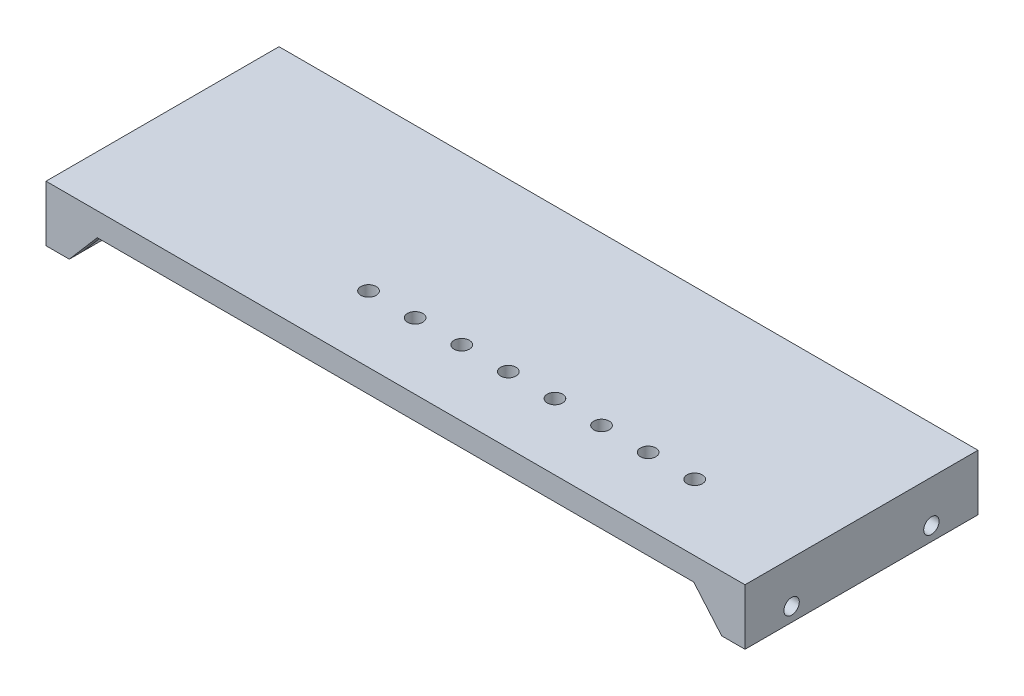
ISO-10303-21;
HEADER;
FILE_DESCRIPTION(('STEP AP214'),'2;1');
FILE_NAME('part.step','',(''),(''),'','','');
FILE_SCHEMA(('AUTOMOTIVE_DESIGN { 1 0 10303 214 1 1 1 1 }'));
ENDSEC;
DATA;
#1=APPLICATION_CONTEXT('core data for automotive mechanical design processes');
#2=APPLICATION_PROTOCOL_DEFINITION('international standard','automotive_design',2000,#1);
#3=PRODUCT_CONTEXT('',#1,'mechanical');
#4=PRODUCT('Part','Part','',(#3));
#5=PRODUCT_RELATED_PRODUCT_CATEGORY('part','',(#4));
#6=PRODUCT_DEFINITION_FORMATION('','',#4);
#7=PRODUCT_DEFINITION_CONTEXT('part definition',#1,'design');
#8=PRODUCT_DEFINITION('design','',#6,#7);
#9=PRODUCT_DEFINITION_SHAPE('','',#8);
#10=(LENGTH_UNIT() NAMED_UNIT(*) SI_UNIT(.MILLI.,.METRE.));
#11=(NAMED_UNIT(*) PLANE_ANGLE_UNIT() SI_UNIT($,.RADIAN.));
#12=(NAMED_UNIT(*) SI_UNIT($,.STERADIAN.) SOLID_ANGLE_UNIT());
#13=UNCERTAINTY_MEASURE_WITH_UNIT(LENGTH_MEASURE(1.E-05),#10,'distance_accuracy_value','');
#14=(GEOMETRIC_REPRESENTATION_CONTEXT(3) GLOBAL_UNCERTAINTY_ASSIGNED_CONTEXT((#13)) GLOBAL_UNIT_ASSIGNED_CONTEXT((#10,
#11,#12)) REPRESENTATION_CONTEXT('',''));
#15=CARTESIAN_POINT('',(0.,0.,0.));
#16=DIRECTION('',(0.,0.,1.));
#17=DIRECTION('',(1.,0.,0.));
#18=AXIS2_PLACEMENT_3D('',#15,#16,#17);
#19=CARTESIAN_POINT('',(70.,-5.00000000000002,50.));
#20=DIRECTION('',(0.,1.,0.));
#21=DIRECTION('',(0.,0.,1.));
#22=AXIS2_PLACEMENT_3D('',#19,#20,#21);
#23=PLANE('',#22);
#24=CARTESIAN_POINT('',(50.,-5.00000000000002,35.79));
#25=DIRECTION('',(0.,1.,0.));
#26=DIRECTION('',(0.,0.,1.));
#27=AXIS2_PLACEMENT_3D('',#24,#25,#26);
#28=CIRCLE('',#27,1.65);
#29=CARTESIAN_POINT('',(50.,-5.00000000000002,37.44));
#30=VERTEX_POINT('',#29);
#31=EDGE_CURVE('E160',#30,#30,#28,.T.);
#32=ORIENTED_EDGE('',*,*,#31,.T.);
#33=EDGE_LOOP('',(#32));
#34=FACE_BOUND('',#33,.T.);
#35=CARTESIAN_POINT('',(40.,-5.00000000000002,35.7900000000001));
#36=DIRECTION('',(0.,1.,0.));
#37=DIRECTION('',(0.,0.,1.));
#38=AXIS2_PLACEMENT_3D('',#35,#36,#37);
#39=CIRCLE('',#38,1.65);
#40=CARTESIAN_POINT('',(40.,-5.00000000000002,37.4400000000001));
#41=VERTEX_POINT('',#40);
#42=EDGE_CURVE('E607',#41,#41,#39,.T.);
#43=ORIENTED_EDGE('',*,*,#42,.T.);
#44=EDGE_LOOP('',(#43));
#45=FACE_BOUND('',#44,.T.);
#46=CARTESIAN_POINT('',(30.,-5.00000000000002,35.7900000000001));
#47=DIRECTION('',(0.,1.,0.));
#48=DIRECTION('',(0.,0.,1.));
#49=AXIS2_PLACEMENT_3D('',#46,#47,#48);
#50=CIRCLE('',#49,1.65);
#51=CARTESIAN_POINT('',(30.,-5.00000000000002,37.4400000000001));
#52=VERTEX_POINT('',#51);
#53=EDGE_CURVE('E609',#52,#52,#50,.T.);
#54=ORIENTED_EDGE('',*,*,#53,.T.);
#55=EDGE_LOOP('',(#54));
#56=FACE_BOUND('',#55,.T.);
#57=CARTESIAN_POINT('',(20.,-5.00000000000002,35.7900000000002));
#58=DIRECTION('',(0.,1.,0.));
#59=DIRECTION('',(0.,0.,1.));
#60=AXIS2_PLACEMENT_3D('',#57,#58,#59);
#61=CIRCLE('',#60,1.65);
#62=CARTESIAN_POINT('',(20.,-5.00000000000002,37.4400000000002));
#63=VERTEX_POINT('',#62);
#64=EDGE_CURVE('E612',#63,#63,#61,.T.);
#65=ORIENTED_EDGE('',*,*,#64,.T.);
#66=EDGE_LOOP('',(#65));
#67=FACE_BOUND('',#66,.T.);
#68=CARTESIAN_POINT('',(9.99999999999999,-5.00000000000002,35.7900000000003));
#69=DIRECTION('',(0.,1.,0.));
#70=DIRECTION('',(0.,0.,1.));
#71=AXIS2_PLACEMENT_3D('',#68,#69,#70);
#72=CIRCLE('',#71,1.65);
#73=CARTESIAN_POINT('',(9.99999999999999,-5.00000000000002,37.4400000000003));
#74=VERTEX_POINT('',#73);
#75=EDGE_CURVE('E617',#74,#74,#72,.T.);
#76=ORIENTED_EDGE('',*,*,#75,.T.);
#77=EDGE_LOOP('',(#76));
#78=FACE_BOUND('',#77,.T.);
#79=CARTESIAN_POINT('',(0.,-5.00000000000002,35.7900000000003));
#80=DIRECTION('',(0.,1.,0.));
#81=DIRECTION('',(0.,0.,1.));
#82=AXIS2_PLACEMENT_3D('',#79,#80,#81);
#83=CIRCLE('',#82,1.65);
#84=CARTESIAN_POINT('',(0.,-5.00000000000002,37.4400000000003));
#85=VERTEX_POINT('',#84);
#86=EDGE_CURVE('E620',#85,#85,#83,.T.);
#87=ORIENTED_EDGE('',*,*,#86,.T.);
#88=EDGE_LOOP('',(#87));
#89=FACE_BOUND('',#88,.T.);
#90=CARTESIAN_POINT('',(-10.,-5.00000000000002,35.7900000000004));
#91=DIRECTION('',(0.,1.,0.));
#92=DIRECTION('',(0.,0.,1.));
#93=AXIS2_PLACEMENT_3D('',#90,#91,#92);
#94=CIRCLE('',#93,1.65);
#95=CARTESIAN_POINT('',(-10.,-5.00000000000002,37.4400000000004));
#96=VERTEX_POINT('',#95);
#97=EDGE_CURVE('E623',#96,#96,#94,.T.);
#98=ORIENTED_EDGE('',*,*,#97,.T.);
#99=EDGE_LOOP('',(#98));
#100=FACE_BOUND('',#99,.T.);
#101=CARTESIAN_POINT('',(-20.,-5.00000000000002,35.7900000000005));
#102=DIRECTION('',(0.,1.,0.));
#103=DIRECTION('',(0.,0.,1.));
#104=AXIS2_PLACEMENT_3D('',#101,#102,#103);
#105=CIRCLE('',#104,1.65);
#106=CARTESIAN_POINT('',(-20.,-5.00000000000002,37.4400000000005));
#107=VERTEX_POINT('',#106);
#108=EDGE_CURVE('E626',#107,#107,#105,.T.);
#109=ORIENTED_EDGE('',*,*,#108,.T.);
#110=EDGE_LOOP('',(#109));
#111=FACE_BOUND('',#110,.T.);
#112=DIRECTION('',(-1.,0.,0.));
#113=VECTOR('',#112,1.);
#114=CARTESIAN_POINT('',(64.,-5.00000000000002,47.));
#115=LINE('',#114,#113);
#116=CARTESIAN_POINT('',(70.,-5.00000000000002,47.));
#117=VERTEX_POINT('',#116);
#118=CARTESIAN_POINT('',(64.,-5.00000000000002,47.));
#119=VERTEX_POINT('',#118);
#120=EDGE_CURVE('E156',#117,#119,#115,.T.);
#121=ORIENTED_EDGE('',*,*,#120,.T.);
#122=DIRECTION('',(0.,0.,1.));
#123=VECTOR('',#122,1.);
#124=CARTESIAN_POINT('',(64.,-5.00000000000002,47.));
#125=LINE('',#124,#123);
#126=CARTESIAN_POINT('',(64.,-5.00000000000002,50.));
#127=VERTEX_POINT('',#126);
#128=EDGE_CURVE('E141',#119,#127,#125,.T.);
#129=ORIENTED_EDGE('',*,*,#128,.T.);
#130=DIRECTION('',(1.,0.,0.));
#131=VECTOR('',#130,1.);
#132=CARTESIAN_POINT('',(70.,-5.00000000000002,50.));
#133=LINE('',#132,#131);
#134=CARTESIAN_POINT('',(-64.,-5.00000000000002,50.));
#135=VERTEX_POINT('',#134);
#136=EDGE_CURVE('E241',#135,#127,#133,.T.);
#137=ORIENTED_EDGE('',*,*,#136,.F.);
#138=DIRECTION('',(0.,0.,1.));
#139=VECTOR('',#138,1.);
#140=CARTESIAN_POINT('',(-64.,-5.00000000000002,47.));
#141=LINE('',#140,#139);
#142=CARTESIAN_POINT('',(-64.,-5.00000000000002,47.));
#143=VERTEX_POINT('',#142);
#144=EDGE_CURVE('E189',#143,#135,#141,.T.);
#145=ORIENTED_EDGE('',*,*,#144,.F.);
#146=DIRECTION('',(1.,0.,0.));
#147=VECTOR('',#146,1.);
#148=CARTESIAN_POINT('',(-64.,-5.00000000000002,47.));
#149=LINE('',#148,#147);
#150=CARTESIAN_POINT('',(-70.,-5.00000000000002,47.));
#151=VERTEX_POINT('',#150);
#152=EDGE_CURVE('E182',#151,#143,#149,.T.);
#153=ORIENTED_EDGE('',*,*,#152,.F.);
#154=DIRECTION('',(0.,0.,-1.));
#155=VECTOR('',#154,1.);
#156=CARTESIAN_POINT('',(-70.,-5.00000000000002,50.));
#157=LINE('',#156,#155);
#158=CARTESIAN_POINT('',(-70.,-5.00000000000002,3.));
#159=VERTEX_POINT('',#158);
#160=EDGE_CURVE('E274',#151,#159,#157,.T.);
#161=ORIENTED_EDGE('',*,*,#160,.T.);
#162=DIRECTION('',(1.,0.,0.));
#163=VECTOR('',#162,1.);
#164=CARTESIAN_POINT('',(-64.,-5.00000000000002,3.));
#165=LINE('',#164,#163);
#166=CARTESIAN_POINT('',(-64.,-5.00000000000002,3.));
#167=VERTEX_POINT('',#166);
#168=EDGE_CURVE('E194',#159,#167,#165,.T.);
#169=ORIENTED_EDGE('',*,*,#168,.T.);
#170=DIRECTION('',(0.,0.,-1.));
#171=VECTOR('',#170,1.);
#172=CARTESIAN_POINT('',(-64.,-5.00000000000002,3.));
#173=LINE('',#172,#171);
#174=CARTESIAN_POINT('',(-64.,-5.00000000000001,0.));
#175=VERTEX_POINT('',#174);
#176=EDGE_CURVE('E202',#167,#175,#173,.T.);
#177=ORIENTED_EDGE('',*,*,#176,.T.);
#178=DIRECTION('',(1.,0.,0.));
#179=VECTOR('',#178,1.);
#180=CARTESIAN_POINT('',(70.,-5.00000000000002,0.));
#181=LINE('',#180,#179);
#182=CARTESIAN_POINT('',(64.,-5.00000000000002,0.));
#183=VERTEX_POINT('',#182);
#184=EDGE_CURVE('E254',#175,#183,#181,.T.);
#185=ORIENTED_EDGE('',*,*,#184,.T.);
#186=DIRECTION('',(0.,0.,-1.));
#187=VECTOR('',#186,1.);
#188=CARTESIAN_POINT('',(64.,-5.00000000000002,3.));
#189=LINE('',#188,#187);
#190=CARTESIAN_POINT('',(64.,-5.00000000000002,3.));
#191=VERTEX_POINT('',#190);
#192=EDGE_CURVE('E54',#191,#183,#189,.T.);
#193=ORIENTED_EDGE('',*,*,#192,.F.);
#194=DIRECTION('',(-1.,0.,0.));
#195=VECTOR('',#194,1.);
#196=CARTESIAN_POINT('',(64.,-5.00000000000002,3.));
#197=LINE('',#196,#195);
#198=CARTESIAN_POINT('',(70.,-5.00000000000002,3.));
#199=VERTEX_POINT('',#198);
#200=EDGE_CURVE('E166',#199,#191,#197,.T.);
#201=ORIENTED_EDGE('',*,*,#200,.F.);
#202=DIRECTION('',(0.,0.,-1.));
#203=VECTOR('',#202,1.);
#204=CARTESIAN_POINT('',(70.,-5.00000000000002,50.));
#205=LINE('',#204,#203);
#206=EDGE_CURVE('E62',#117,#199,#205,.T.);
#207=ORIENTED_EDGE('',*,*,#206,.F.);
#208=EDGE_LOOP('',(#121,#129,#137,#145,#153,#161,#169,#177,#185,#193,#201,#207));
#209=FACE_BOUND('',#208,.T.);
#210=ADVANCED_FACE('F39',(#34,#45,#56,#67,#78,#89,#100,#111,#209),#23,.F.);
#211=CARTESIAN_POINT('',(-75.,-12.,50.));
#212=DIRECTION('',(1.,0.,0.));
#213=DIRECTION('',(0.,0.,-1.));
#214=AXIS2_PLACEMENT_3D('',#211,#212,#213);
#215=PLANE('',#214);
#216=CARTESIAN_POINT('',(-75.,-8.99999999999999,10.));
#217=DIRECTION('',(1.,0.,0.));
#218=DIRECTION('',(0.,1.,0.));
#219=AXIS2_PLACEMENT_3D('',#216,#217,#218);
#220=CIRCLE('',#219,1.65);
#221=CARTESIAN_POINT('',(-75.,-7.34999999999999,10.));
#222=VERTEX_POINT('',#221);
#223=EDGE_CURVE('E213',#222,#222,#220,.T.);
#224=ORIENTED_EDGE('',*,*,#223,.T.);
#225=EDGE_LOOP('',(#224));
#226=FACE_BOUND('',#225,.T.);
#227=CARTESIAN_POINT('',(-75.,-8.99999999999999,40.));
#228=DIRECTION('',(1.,0.,0.));
#229=DIRECTION('',(0.,-1.,0.));
#230=AXIS2_PLACEMENT_3D('',#227,#228,#229);
#231=CIRCLE('',#230,1.65);
#232=CARTESIAN_POINT('',(-75.,-10.65,40.));
#233=VERTEX_POINT('',#232);
#234=EDGE_CURVE('E214',#233,#233,#231,.T.);
#235=ORIENTED_EDGE('',*,*,#234,.T.);
#236=EDGE_LOOP('',(#235));
#237=FACE_BOUND('',#236,.T.);
#238=DIRECTION('',(0.,-1.,0.));
#239=VECTOR('',#238,1.);
#240=CARTESIAN_POINT('',(-75.,-12.,0.));
#241=LINE('',#240,#239);
#242=CARTESIAN_POINT('',(-75.,0.,0.));
#243=VERTEX_POINT('',#242);
#244=CARTESIAN_POINT('',(-75.,-12.,0.));
#245=VERTEX_POINT('',#244);
#246=EDGE_CURVE('E233',#243,#245,#241,.T.);
#247=ORIENTED_EDGE('',*,*,#246,.T.);
#248=DIRECTION('',(0.,0.,-1.));
#249=VECTOR('',#248,1.);
#250=CARTESIAN_POINT('',(-75.,-12.,50.));
#251=LINE('',#250,#249);
#252=CARTESIAN_POINT('',(-75.,-12.,50.));
#253=VERTEX_POINT('',#252);
#254=EDGE_CURVE('E11',#253,#245,#251,.T.);
#255=ORIENTED_EDGE('',*,*,#254,.F.);
#256=DIRECTION('',(0.,-1.,0.));
#257=VECTOR('',#256,1.);
#258=CARTESIAN_POINT('',(-75.,-12.,50.));
#259=LINE('',#258,#257);
#260=CARTESIAN_POINT('',(-75.,0.,50.));
#261=VERTEX_POINT('',#260);
#262=EDGE_CURVE('E234',#261,#253,#259,.T.);
#263=ORIENTED_EDGE('',*,*,#262,.F.);
#264=DIRECTION('',(0.,0.,-1.));
#265=VECTOR('',#264,1.);
#266=CARTESIAN_POINT('',(-75.,0.,50.));
#267=LINE('',#266,#265);
#268=EDGE_CURVE('E249',#261,#243,#267,.T.);
#269=ORIENTED_EDGE('',*,*,#268,.T.);
#270=EDGE_LOOP('',(#247,#255,#263,#269));
#271=FACE_BOUND('',#270,.T.);
#272=ADVANCED_FACE('F41',(#226,#237,#271),#215,.F.);
#273=CARTESIAN_POINT('',(-70.,-12.,50.));
#274=DIRECTION('',(0.,1.,0.));
#275=DIRECTION('',(-1.,0.,0.));
#276=AXIS2_PLACEMENT_3D('',#273,#274,#275);
#277=PLANE('',#276);
#278=DIRECTION('',(1.,0.,0.));
#279=VECTOR('',#278,1.);
#280=CARTESIAN_POINT('',(-70.,-12.,0.));
#281=LINE('',#280,#279);
#282=CARTESIAN_POINT('',(-70.,-12.,0.));
#283=VERTEX_POINT('',#282);
#284=EDGE_CURVE('E252',#245,#283,#281,.T.);
#285=ORIENTED_EDGE('',*,*,#284,.T.);
#286=DIRECTION('',(0.,0.,-1.));
#287=VECTOR('',#286,1.);
#288=CARTESIAN_POINT('',(-70.,-12.,3.));
#289=LINE('',#288,#287);
#290=CARTESIAN_POINT('',(-70.,-12.,3.));
#291=VERTEX_POINT('',#290);
#292=EDGE_CURVE('E205',#291,#283,#289,.T.);
#293=ORIENTED_EDGE('',*,*,#292,.F.);
#294=DIRECTION('',(0.,0.,-1.));
#295=VECTOR('',#294,1.);
#296=CARTESIAN_POINT('',(-70.,-12.,50.));
#297=LINE('',#296,#295);
#298=CARTESIAN_POINT('',(-70.,-12.,47.));
#299=VERTEX_POINT('',#298);
#300=EDGE_CURVE('E275',#299,#291,#297,.T.);
#301=ORIENTED_EDGE('',*,*,#300,.F.);
#302=CARTESIAN_POINT('',(-70.,-12.,50.));
#303=VERTEX_POINT('',#302);
#304=EDGE_CURVE('E47',#303,#299,#297,.T.);
#305=ORIENTED_EDGE('',*,*,#304,.F.);
#306=DIRECTION('',(1.,0.,0.));
#307=VECTOR('',#306,1.);
#308=CARTESIAN_POINT('',(-70.,-12.,50.));
#309=LINE('',#308,#307);
#310=EDGE_CURVE('E237',#253,#303,#309,.T.);
#311=ORIENTED_EDGE('',*,*,#310,.F.);
#312=ORIENTED_EDGE('',*,*,#254,.T.);
#313=EDGE_LOOP('',(#285,#293,#301,#305,#311,#312));
#314=FACE_BOUND('',#313,.T.);
#315=ADVANCED_FACE('F288',(#314),#277,.F.);
#316=CARTESIAN_POINT('',(-70.,-5.00000000000002,50.));
#317=DIRECTION('',(-1.,0.,0.));
#318=DIRECTION('',(0.,-1.,0.));
#319=AXIS2_PLACEMENT_3D('',#316,#317,#318);
#320=PLANE('',#319);
#321=CARTESIAN_POINT('',(-70.,-9.,10.));
#322=DIRECTION('',(-1.,0.,0.));
#323=DIRECTION('',(0.,-1.,0.));
#324=AXIS2_PLACEMENT_3D('',#321,#322,#323);
#325=CIRCLE('',#324,1.65);
#326=CARTESIAN_POINT('',(-70.,-10.65,10.));
#327=VERTEX_POINT('',#326);
#328=EDGE_CURVE('E230',#327,#327,#325,.T.);
#329=ORIENTED_EDGE('',*,*,#328,.T.);
#330=EDGE_LOOP('',(#329));
#331=FACE_BOUND('',#330,.T.);
#332=CARTESIAN_POINT('',(-70.,-9.,40.));
#333=DIRECTION('',(-1.,0.,0.));
#334=DIRECTION('',(0.,-1.,0.));
#335=AXIS2_PLACEMENT_3D('',#332,#333,#334);
#336=CIRCLE('',#335,1.65);
#337=CARTESIAN_POINT('',(-70.,-10.65,40.));
#338=VERTEX_POINT('',#337);
#339=EDGE_CURVE('E224',#338,#338,#336,.T.);
#340=ORIENTED_EDGE('',*,*,#339,.T.);
#341=EDGE_LOOP('',(#340));
#342=FACE_BOUND('',#341,.T.);
#343=ORIENTED_EDGE('',*,*,#160,.F.);
#344=DIRECTION('',(0.,1.,0.));
#345=VECTOR('',#344,1.);
#346=CARTESIAN_POINT('',(-70.,-5.00000000000002,47.));
#347=LINE('',#346,#345);
#348=EDGE_CURVE('E185',#299,#151,#347,.T.);
#349=ORIENTED_EDGE('',*,*,#348,.F.);
#350=ORIENTED_EDGE('',*,*,#300,.T.);
#351=DIRECTION('',(0.,1.,0.));
#352=VECTOR('',#351,1.);
#353=CARTESIAN_POINT('',(-70.,-5.00000000000002,3.));
#354=LINE('',#353,#352);
#355=EDGE_CURVE('E199',#291,#159,#354,.T.);
#356=ORIENTED_EDGE('',*,*,#355,.T.);
#357=EDGE_LOOP('',(#343,#349,#350,#356));
#358=FACE_BOUND('',#357,.T.);
#359=ADVANCED_FACE('F284',(#331,#342,#358),#320,.F.);
#360=CARTESIAN_POINT('',(70.,-12.,50.));
#361=DIRECTION('',(1.,0.,0.));
#362=DIRECTION('',(0.,1.,0.));
#363=AXIS2_PLACEMENT_3D('',#360,#361,#362);
#364=PLANE('',#363);
#365=CARTESIAN_POINT('',(70.,-9.00000000000008,10.));
#366=DIRECTION('',(1.,0.,0.));
#367=DIRECTION('',(0.,1.,0.));
#368=AXIS2_PLACEMENT_3D('',#365,#366,#367);
#369=CIRCLE('',#368,1.65);
#370=CARTESIAN_POINT('',(70.,-7.35000000000008,10.));
#371=VERTEX_POINT('',#370);
#372=EDGE_CURVE('E227',#371,#371,#369,.T.);
#373=ORIENTED_EDGE('',*,*,#372,.T.);
#374=EDGE_LOOP('',(#373));
#375=FACE_BOUND('',#374,.T.);
#376=CARTESIAN_POINT('',(70.,-9.00000000000008,40.));
#377=DIRECTION('',(1.,0.,0.));
#378=DIRECTION('',(0.,1.,0.));
#379=AXIS2_PLACEMENT_3D('',#376,#377,#378);
#380=CIRCLE('',#379,1.65);
#381=CARTESIAN_POINT('',(70.,-7.35000000000007,40.));
#382=VERTEX_POINT('',#381);
#383=EDGE_CURVE('E217',#382,#382,#380,.T.);
#384=ORIENTED_EDGE('',*,*,#383,.T.);
#385=EDGE_LOOP('',(#384));
#386=FACE_BOUND('',#385,.T.);
#387=DIRECTION('',(0.,0.,-1.));
#388=VECTOR('',#387,1.);
#389=CARTESIAN_POINT('',(70.,-12.,50.));
#390=LINE('',#389,#388);
#391=CARTESIAN_POINT('',(70.,-12.,47.));
#392=VERTEX_POINT('',#391);
#393=CARTESIAN_POINT('',(70.,-12.,3.));
#394=VERTEX_POINT('',#393);
#395=EDGE_CURVE('E269',#392,#394,#390,.T.);
#396=ORIENTED_EDGE('',*,*,#395,.F.);
#397=DIRECTION('',(0.,1.,0.));
#398=VECTOR('',#397,1.);
#399=CARTESIAN_POINT('',(70.,-5.00000000000002,47.));
#400=LINE('',#399,#398);
#401=EDGE_CURVE('E152',#392,#117,#400,.T.);
#402=ORIENTED_EDGE('',*,*,#401,.T.);
#403=ORIENTED_EDGE('',*,*,#206,.T.);
#404=DIRECTION('',(0.,1.,0.));
#405=VECTOR('',#404,1.);
#406=CARTESIAN_POINT('',(70.,-5.00000000000002,3.));
#407=LINE('',#406,#405);
#408=EDGE_CURVE('E169',#394,#199,#407,.T.);
#409=ORIENTED_EDGE('',*,*,#408,.F.);
#410=EDGE_LOOP('',(#396,#402,#403,#409));
#411=FACE_BOUND('',#410,.T.);
#412=ADVANCED_FACE('F319',(#375,#386,#411),#364,.F.);
#413=CARTESIAN_POINT('',(75.,-12.,50.));
#414=DIRECTION('',(0.,1.,0.));
#415=DIRECTION('',(0.,0.,1.));
#416=AXIS2_PLACEMENT_3D('',#413,#414,#415);
#417=PLANE('',#416);
#418=DIRECTION('',(1.,0.,0.));
#419=VECTOR('',#418,1.);
#420=CARTESIAN_POINT('',(75.,-12.,0.));
#421=LINE('',#420,#419);
#422=CARTESIAN_POINT('',(70.,-12.,0.));
#423=VERTEX_POINT('',#422);
#424=CARTESIAN_POINT('',(75.,-12.,0.));
#425=VERTEX_POINT('',#424);
#426=EDGE_CURVE('E256',#423,#425,#421,.T.);
#427=ORIENTED_EDGE('',*,*,#426,.T.);
#428=DIRECTION('',(0.,0.,-1.));
#429=VECTOR('',#428,1.);
#430=CARTESIAN_POINT('',(75.,-12.,50.));
#431=LINE('',#430,#429);
#432=CARTESIAN_POINT('',(75.,-12.,50.));
#433=VERTEX_POINT('',#432);
#434=EDGE_CURVE('E266',#433,#425,#431,.T.);
#435=ORIENTED_EDGE('',*,*,#434,.F.);
#436=DIRECTION('',(1.,0.,0.));
#437=VECTOR('',#436,1.);
#438=CARTESIAN_POINT('',(75.,-12.,50.));
#439=LINE('',#438,#437);
#440=CARTESIAN_POINT('',(70.,-12.,50.));
#441=VERTEX_POINT('',#440);
#442=EDGE_CURVE('E243',#441,#433,#439,.T.);
#443=ORIENTED_EDGE('',*,*,#442,.F.);
#444=EDGE_CURVE('E270',#441,#392,#390,.T.);
#445=ORIENTED_EDGE('',*,*,#444,.T.);
#446=ORIENTED_EDGE('',*,*,#395,.T.);
#447=DIRECTION('',(0.,0.,-1.));
#448=VECTOR('',#447,1.);
#449=CARTESIAN_POINT('',(70.,-12.,3.));
#450=LINE('',#449,#448);
#451=EDGE_CURVE('E175',#394,#423,#450,.T.);
#452=ORIENTED_EDGE('',*,*,#451,.T.);
#453=EDGE_LOOP('',(#427,#435,#443,#445,#446,#452));
#454=FACE_BOUND('',#453,.T.);
#455=ADVANCED_FACE('F322',(#454),#417,.F.);
#456=CARTESIAN_POINT('',(75.,0.,50.));
#457=DIRECTION('',(-1.,0.,0.));
#458=DIRECTION('',(0.,0.,1.));
#459=AXIS2_PLACEMENT_3D('',#456,#457,#458);
#460=PLANE('',#459);
#461=CARTESIAN_POINT('',(75.,-9.00000000000008,10.));
#462=DIRECTION('',(1.,0.,0.));
#463=DIRECTION('',(0.,1.,0.));
#464=AXIS2_PLACEMENT_3D('',#461,#462,#463);
#465=CIRCLE('',#464,1.65);
#466=CARTESIAN_POINT('',(75.,-7.35000000000008,10.));
#467=VERTEX_POINT('',#466);
#468=EDGE_CURVE('E210',#467,#467,#465,.T.);
#469=ORIENTED_EDGE('',*,*,#468,.F.);
#470=EDGE_LOOP('',(#469));
#471=FACE_BOUND('',#470,.T.);
#472=CARTESIAN_POINT('',(75.,-9.00000000000008,40.));
#473=DIRECTION('',(1.,0.,0.));
#474=DIRECTION('',(0.,-1.,0.));
#475=AXIS2_PLACEMENT_3D('',#472,#473,#474);
#476=CIRCLE('',#475,1.65);
#477=CARTESIAN_POINT('',(75.,-10.6500000000001,40.));
#478=VERTEX_POINT('',#477);
#479=EDGE_CURVE('E208',#478,#478,#476,.T.);
#480=ORIENTED_EDGE('',*,*,#479,.F.);
#481=EDGE_LOOP('',(#480));
#482=FACE_BOUND('',#481,.T.);
#483=DIRECTION('',(0.,1.,0.));
#484=VECTOR('',#483,1.);
#485=CARTESIAN_POINT('',(75.,0.,0.));
#486=LINE('',#485,#484);
#487=CARTESIAN_POINT('',(75.,0.,0.));
#488=VERTEX_POINT('',#487);
#489=EDGE_CURVE('E258',#425,#488,#486,.T.);
#490=ORIENTED_EDGE('',*,*,#489,.T.);
#491=DIRECTION('',(0.,0.,-1.));
#492=VECTOR('',#491,1.);
#493=CARTESIAN_POINT('',(75.,0.,50.));
#494=LINE('',#493,#492);
#495=CARTESIAN_POINT('',(75.,0.,50.));
#496=VERTEX_POINT('',#495);
#497=EDGE_CURVE('E263',#496,#488,#494,.T.);
#498=ORIENTED_EDGE('',*,*,#497,.F.);
#499=DIRECTION('',(0.,1.,0.));
#500=VECTOR('',#499,1.);
#501=CARTESIAN_POINT('',(75.,0.,50.));
#502=LINE('',#501,#500);
#503=EDGE_CURVE('E245',#433,#496,#502,.T.);
#504=ORIENTED_EDGE('',*,*,#503,.F.);
#505=ORIENTED_EDGE('',*,*,#434,.T.);
#506=EDGE_LOOP('',(#490,#498,#504,#505));
#507=FACE_BOUND('',#506,.T.);
#508=ADVANCED_FACE('F328',(#471,#482,#507),#460,.F.);
#509=CARTESIAN_POINT('',(-75.,0.,50.));
#510=DIRECTION('',(0.,-1.,0.));
#511=DIRECTION('',(0.,0.,-1.));
#512=AXIS2_PLACEMENT_3D('',#509,#510,#511);
#513=PLANE('',#512);
#514=CARTESIAN_POINT('',(50.,0.,35.79));
#515=DIRECTION('',(0.,1.,0.));
#516=DIRECTION('',(0.,0.,1.));
#517=AXIS2_PLACEMENT_3D('',#514,#515,#516);
#518=CIRCLE('',#517,1.65);
#519=CARTESIAN_POINT('',(50.,0.,37.44));
#520=VERTEX_POINT('',#519);
#521=EDGE_CURVE('E605',#520,#520,#518,.T.);
#522=ORIENTED_EDGE('',*,*,#521,.F.);
#523=EDGE_LOOP('',(#522));
#524=FACE_BOUND('',#523,.T.);
#525=CARTESIAN_POINT('',(40.,0.,35.7900000000001));
#526=DIRECTION('',(0.,1.,0.));
#527=DIRECTION('',(0.,0.,1.));
#528=AXIS2_PLACEMENT_3D('',#525,#526,#527);
#529=CIRCLE('',#528,1.65);
#530=CARTESIAN_POINT('',(40.,0.,37.4400000000001));
#531=VERTEX_POINT('',#530);
#532=EDGE_CURVE('E647',#531,#531,#529,.T.);
#533=ORIENTED_EDGE('',*,*,#532,.F.);
#534=EDGE_LOOP('',(#533));
#535=FACE_BOUND('',#534,.T.);
#536=CARTESIAN_POINT('',(30.,0.,35.7900000000001));
#537=DIRECTION('',(0.,1.,0.));
#538=DIRECTION('',(0.,0.,1.));
#539=AXIS2_PLACEMENT_3D('',#536,#537,#538);
#540=CIRCLE('',#539,1.65);
#541=CARTESIAN_POINT('',(30.,0.,37.4400000000001));
#542=VERTEX_POINT('',#541);
#543=EDGE_CURVE('E644',#542,#542,#540,.T.);
#544=ORIENTED_EDGE('',*,*,#543,.F.);
#545=EDGE_LOOP('',(#544));
#546=FACE_BOUND('',#545,.T.);
#547=CARTESIAN_POINT('',(20.,0.,35.7900000000002));
#548=DIRECTION('',(0.,1.,0.));
#549=DIRECTION('',(0.,0.,1.));
#550=AXIS2_PLACEMENT_3D('',#547,#548,#549);
#551=CIRCLE('',#550,1.65);
#552=CARTESIAN_POINT('',(20.,0.,37.4400000000002));
#553=VERTEX_POINT('',#552);
#554=EDGE_CURVE('E641',#553,#553,#551,.T.);
#555=ORIENTED_EDGE('',*,*,#554,.F.);
#556=EDGE_LOOP('',(#555));
#557=FACE_BOUND('',#556,.T.);
#558=CARTESIAN_POINT('',(9.99999999999999,0.,35.7900000000003));
#559=DIRECTION('',(0.,1.,0.));
#560=DIRECTION('',(0.,0.,1.));
#561=AXIS2_PLACEMENT_3D('',#558,#559,#560);
#562=CIRCLE('',#561,1.65);
#563=CARTESIAN_POINT('',(9.99999999999999,0.,37.4400000000003));
#564=VERTEX_POINT('',#563);
#565=EDGE_CURVE('E638',#564,#564,#562,.T.);
#566=ORIENTED_EDGE('',*,*,#565,.F.);
#567=EDGE_LOOP('',(#566));
#568=FACE_BOUND('',#567,.T.);
#569=CARTESIAN_POINT('',(0.,0.,35.7900000000003));
#570=DIRECTION('',(0.,1.,0.));
#571=DIRECTION('',(0.,0.,1.));
#572=AXIS2_PLACEMENT_3D('',#569,#570,#571);
#573=CIRCLE('',#572,1.65);
#574=CARTESIAN_POINT('',(0.,0.,37.4400000000003));
#575=VERTEX_POINT('',#574);
#576=EDGE_CURVE('E635',#575,#575,#573,.T.);
#577=ORIENTED_EDGE('',*,*,#576,.F.);
#578=EDGE_LOOP('',(#577));
#579=FACE_BOUND('',#578,.T.);
#580=CARTESIAN_POINT('',(-10.,0.,35.7900000000004));
#581=DIRECTION('',(0.,1.,0.));
#582=DIRECTION('',(0.,0.,1.));
#583=AXIS2_PLACEMENT_3D('',#580,#581,#582);
#584=CIRCLE('',#583,1.65);
#585=CARTESIAN_POINT('',(-10.,0.,37.4400000000004));
#586=VERTEX_POINT('',#585);
#587=EDGE_CURVE('E632',#586,#586,#584,.T.);
#588=ORIENTED_EDGE('',*,*,#587,.F.);
#589=EDGE_LOOP('',(#588));
#590=FACE_BOUND('',#589,.T.);
#591=CARTESIAN_POINT('',(-20.,0.,35.7900000000005));
#592=DIRECTION('',(0.,1.,0.));
#593=DIRECTION('',(0.,0.,1.));
#594=AXIS2_PLACEMENT_3D('',#591,#592,#593);
#595=CIRCLE('',#594,1.65);
#596=CARTESIAN_POINT('',(-20.,0.,37.4400000000005));
#597=VERTEX_POINT('',#596);
#598=EDGE_CURVE('E629',#597,#597,#595,.T.);
#599=ORIENTED_EDGE('',*,*,#598,.F.);
#600=EDGE_LOOP('',(#599));
#601=FACE_BOUND('',#600,.T.);
#602=DIRECTION('',(-1.,0.,0.));
#603=VECTOR('',#602,1.);
#604=CARTESIAN_POINT('',(-75.,0.,0.));
#605=LINE('',#604,#603);
#606=EDGE_CURVE('E238',#488,#243,#605,.T.);
#607=ORIENTED_EDGE('',*,*,#606,.T.);
#608=ORIENTED_EDGE('',*,*,#268,.F.);
#609=DIRECTION('',(-1.,0.,0.));
#610=VECTOR('',#609,1.);
#611=CARTESIAN_POINT('',(-75.,0.,50.));
#612=LINE('',#611,#610);
#613=EDGE_CURVE('E247',#496,#261,#612,.T.);
#614=ORIENTED_EDGE('',*,*,#613,.F.);
#615=ORIENTED_EDGE('',*,*,#497,.T.);
#616=EDGE_LOOP('',(#607,#608,#614,#615));
#617=FACE_BOUND('',#616,.T.);
#618=ADVANCED_FACE('F330',(#524,#535,#546,#557,#568,#579,#590,#601,#617),#513,.F.);
#619=CARTESIAN_POINT('',(0.,0.,50.));
#620=DIRECTION('',(0.,0.,-1.));
#621=DIRECTION('',(-1.,0.,0.));
#622=AXIS2_PLACEMENT_3D('',#619,#620,#621);
#623=PLANE('',#622);
#624=ORIENTED_EDGE('',*,*,#136,.T.);
#625=DIRECTION('',(0.650791373455969,-0.759256602365296,0.));
#626=VECTOR('',#625,1.);
#627=CARTESIAN_POINT('',(64.,-5.00000000000002,50.));
#628=LINE('',#627,#626);
#629=EDGE_CURVE('E147',#127,#441,#628,.T.);
#630=ORIENTED_EDGE('',*,*,#629,.T.);
#631=ORIENTED_EDGE('',*,*,#442,.T.);
#632=ORIENTED_EDGE('',*,*,#503,.T.);
#633=ORIENTED_EDGE('',*,*,#613,.T.);
#634=ORIENTED_EDGE('',*,*,#262,.T.);
#635=ORIENTED_EDGE('',*,*,#310,.T.);
#636=DIRECTION('',(-0.650791373455969,-0.759256602365296,0.));
#637=VECTOR('',#636,1.);
#638=CARTESIAN_POINT('',(-64.,-5.00000000000002,50.));
#639=LINE('',#638,#637);
#640=EDGE_CURVE('E179',#135,#303,#639,.T.);
#641=ORIENTED_EDGE('',*,*,#640,.F.);
#642=EDGE_LOOP('',(#624,#630,#631,#632,#633,#634,#635,#641));
#643=FACE_BOUND('',#642,.T.);
#644=ADVANCED_FACE('F303',(#643),#623,.F.);
#645=CARTESIAN_POINT('',(0.,0.,0.));
#646=DIRECTION('',(0.,0.,-1.));
#647=DIRECTION('',(-1.,0.,0.));
#648=AXIS2_PLACEMENT_3D('',#645,#646,#647);
#649=PLANE('',#648);
#650=DIRECTION('',(0.650791373455969,-0.759256602365296,0.));
#651=VECTOR('',#650,1.);
#652=CARTESIAN_POINT('',(64.,-5.00000000000002,0.));
#653=LINE('',#652,#651);
#654=EDGE_CURVE('E151',#183,#423,#653,.T.);
#655=ORIENTED_EDGE('',*,*,#654,.F.);
#656=ORIENTED_EDGE('',*,*,#184,.F.);
#657=DIRECTION('',(-0.650791373455969,-0.759256602365296,0.));
#658=VECTOR('',#657,1.);
#659=CARTESIAN_POINT('',(-64.,-5.00000000000002,0.));
#660=LINE('',#659,#658);
#661=EDGE_CURVE('E193',#175,#283,#660,.T.);
#662=ORIENTED_EDGE('',*,*,#661,.T.);
#663=ORIENTED_EDGE('',*,*,#284,.F.);
#664=ORIENTED_EDGE('',*,*,#246,.F.);
#665=ORIENTED_EDGE('',*,*,#606,.F.);
#666=ORIENTED_EDGE('',*,*,#489,.F.);
#667=ORIENTED_EDGE('',*,*,#426,.F.);
#668=EDGE_LOOP('',(#655,#656,#662,#663,#664,#665,#666,#667));
#669=FACE_BOUND('',#668,.T.);
#670=ADVANCED_FACE('F312',(#669),#649,.T.);
#671=CARTESIAN_POINT('',(-75.,-8.99999999999999,40.));
#672=DIRECTION('',(1.,0.,0.));
#673=DIRECTION('',(0.,1.,0.));
#674=AXIS2_PLACEMENT_3D('',#671,#672,#673);
#675=CYLINDRICAL_SURFACE('',#674,1.65);
#676=ORIENTED_EDGE('',*,*,#479,.T.);
#677=EDGE_LOOP('',(#676));
#678=FACE_BOUND('',#677,.T.);
#679=ORIENTED_EDGE('',*,*,#383,.F.);
#680=EDGE_LOOP('',(#679));
#681=FACE_BOUND('',#680,.T.);
#682=ADVANCED_FACE('F394',(#678,#681),#675,.F.);
#683=CARTESIAN_POINT('',(-75.,-8.99999999999999,10.));
#684=DIRECTION('',(1.,0.,0.));
#685=DIRECTION('',(0.,1.,0.));
#686=AXIS2_PLACEMENT_3D('',#683,#684,#685);
#687=CYLINDRICAL_SURFACE('',#686,1.65);
#688=ORIENTED_EDGE('',*,*,#468,.T.);
#689=EDGE_LOOP('',(#688));
#690=FACE_BOUND('',#689,.T.);
#691=ORIENTED_EDGE('',*,*,#372,.F.);
#692=EDGE_LOOP('',(#691));
#693=FACE_BOUND('',#692,.T.);
#694=ADVANCED_FACE('F399',(#690,#693),#687,.F.);
#695=ORIENTED_EDGE('',*,*,#234,.F.);
#696=EDGE_LOOP('',(#695));
#697=FACE_BOUND('',#696,.T.);
#698=ORIENTED_EDGE('',*,*,#339,.F.);
#699=EDGE_LOOP('',(#698));
#700=FACE_BOUND('',#699,.T.);
#701=ADVANCED_FACE('F402',(#697,#700),#675,.F.);
#702=ORIENTED_EDGE('',*,*,#223,.F.);
#703=EDGE_LOOP('',(#702));
#704=FACE_BOUND('',#703,.T.);
#705=ORIENTED_EDGE('',*,*,#328,.F.);
#706=EDGE_LOOP('',(#705));
#707=FACE_BOUND('',#706,.T.);
#708=ADVANCED_FACE('F414',(#704,#707),#687,.F.);
#709=CARTESIAN_POINT('',(-64.,-5.00000000000002,3.));
#710=DIRECTION('',(0.759256602365296,-0.650791373455969,0.));
#711=DIRECTION('',(0.650791373455969,0.759256602365296,0.));
#712=AXIS2_PLACEMENT_3D('',#709,#710,#711);
#713=PLANE('',#712);
#714=ORIENTED_EDGE('',*,*,#661,.F.);
#715=ORIENTED_EDGE('',*,*,#176,.F.);
#716=DIRECTION('',(-0.650791373455969,-0.759256602365296,0.));
#717=VECTOR('',#716,1.);
#718=CARTESIAN_POINT('',(-64.,-5.00000000000002,3.));
#719=LINE('',#718,#717);
#720=EDGE_CURVE('E196',#167,#291,#719,.T.);
#721=ORIENTED_EDGE('',*,*,#720,.T.);
#722=ORIENTED_EDGE('',*,*,#292,.T.);
#723=EDGE_LOOP('',(#714,#715,#721,#722));
#724=FACE_BOUND('',#723,.T.);
#725=ADVANCED_FACE('F293',(#724),#713,.T.);
#726=CARTESIAN_POINT('',(0.,0.,3.));
#727=DIRECTION('',(0.,0.,1.));
#728=DIRECTION('',(1.,0.,0.));
#729=AXIS2_PLACEMENT_3D('',#726,#727,#728);
#730=PLANE('',#729);
#731=ORIENTED_EDGE('',*,*,#168,.F.);
#732=ORIENTED_EDGE('',*,*,#355,.F.);
#733=ORIENTED_EDGE('',*,*,#720,.F.);
#734=EDGE_LOOP('',(#731,#732,#733));
#735=FACE_BOUND('',#734,.T.);
#736=ADVANCED_FACE('F295',(#735),#730,.T.);
#737=CARTESIAN_POINT('',(-64.,-5.00000000000002,47.));
#738=DIRECTION('',(-0.759256602365296,0.650791373455969,0.));
#739=DIRECTION('',(-0.650791373455969,-0.759256602365296,0.));
#740=AXIS2_PLACEMENT_3D('',#737,#738,#739);
#741=PLANE('',#740);
#742=ORIENTED_EDGE('',*,*,#640,.T.);
#743=ORIENTED_EDGE('',*,*,#304,.T.);
#744=DIRECTION('',(-0.650791373455969,-0.759256602365296,0.));
#745=VECTOR('',#744,1.);
#746=CARTESIAN_POINT('',(-64.,-5.00000000000002,47.));
#747=LINE('',#746,#745);
#748=EDGE_CURVE('E187',#143,#299,#747,.T.);
#749=ORIENTED_EDGE('',*,*,#748,.F.);
#750=ORIENTED_EDGE('',*,*,#144,.T.);
#751=EDGE_LOOP('',(#742,#743,#749,#750));
#752=FACE_BOUND('',#751,.T.);
#753=ADVANCED_FACE('F301',(#752),#741,.F.);
#754=CARTESIAN_POINT('',(0.,0.,47.));
#755=DIRECTION('',(0.,0.,-1.));
#756=DIRECTION('',(1.,0.,0.));
#757=AXIS2_PLACEMENT_3D('',#754,#755,#756);
#758=PLANE('',#757);
#759=ORIENTED_EDGE('',*,*,#152,.T.);
#760=ORIENTED_EDGE('',*,*,#748,.T.);
#761=ORIENTED_EDGE('',*,*,#348,.T.);
#762=EDGE_LOOP('',(#759,#760,#761));
#763=FACE_BOUND('',#762,.T.);
#764=ADVANCED_FACE('F300',(#763),#758,.T.);
#765=CARTESIAN_POINT('',(64.,-5.00000000000002,3.));
#766=DIRECTION('',(0.759256602365296,0.650791373455969,0.));
#767=DIRECTION('',(-0.650791373455969,0.759256602365296,0.));
#768=AXIS2_PLACEMENT_3D('',#765,#766,#767);
#769=PLANE('',#768);
#770=ORIENTED_EDGE('',*,*,#654,.T.);
#771=ORIENTED_EDGE('',*,*,#451,.F.);
#772=DIRECTION('',(0.650791373455969,-0.759256602365296,0.));
#773=VECTOR('',#772,1.);
#774=CARTESIAN_POINT('',(64.,-5.00000000000002,3.));
#775=LINE('',#774,#773);
#776=EDGE_CURVE('E172',#191,#394,#775,.T.);
#777=ORIENTED_EDGE('',*,*,#776,.F.);
#778=ORIENTED_EDGE('',*,*,#192,.T.);
#779=EDGE_LOOP('',(#770,#771,#777,#778));
#780=FACE_BOUND('',#779,.T.);
#781=ADVANCED_FACE('F316',(#780),#769,.F.);
#782=CARTESIAN_POINT('',(0.,0.,3.));
#783=DIRECTION('',(0.,0.,1.));
#784=DIRECTION('',(-1.,0.,0.));
#785=AXIS2_PLACEMENT_3D('',#782,#783,#784);
#786=PLANE('',#785);
#787=ORIENTED_EDGE('',*,*,#200,.T.);
#788=ORIENTED_EDGE('',*,*,#776,.T.);
#789=ORIENTED_EDGE('',*,*,#408,.T.);
#790=EDGE_LOOP('',(#787,#788,#789));
#791=FACE_BOUND('',#790,.T.);
#792=ADVANCED_FACE('F318',(#791),#786,.T.);
#793=CARTESIAN_POINT('',(64.,-5.00000000000002,47.));
#794=DIRECTION('',(-0.759256602365296,-0.650791373455969,0.));
#795=DIRECTION('',(0.650791373455969,-0.759256602365296,0.));
#796=AXIS2_PLACEMENT_3D('',#793,#794,#795);
#797=PLANE('',#796);
#798=ORIENTED_EDGE('',*,*,#629,.F.);
#799=ORIENTED_EDGE('',*,*,#128,.F.);
#800=DIRECTION('',(0.650791373455969,-0.759256602365296,0.));
#801=VECTOR('',#800,1.);
#802=CARTESIAN_POINT('',(64.,-5.00000000000002,47.));
#803=LINE('',#802,#801);
#804=EDGE_CURVE('E145',#119,#392,#803,.T.);
#805=ORIENTED_EDGE('',*,*,#804,.T.);
#806=ORIENTED_EDGE('',*,*,#444,.F.);
#807=EDGE_LOOP('',(#798,#799,#805,#806));
#808=FACE_BOUND('',#807,.T.);
#809=ADVANCED_FACE('F143',(#808),#797,.T.);
#810=CARTESIAN_POINT('',(0.,0.,47.));
#811=DIRECTION('',(0.,0.,-1.));
#812=DIRECTION('',(-1.,0.,0.));
#813=AXIS2_PLACEMENT_3D('',#810,#811,#812);
#814=PLANE('',#813);
#815=ORIENTED_EDGE('',*,*,#120,.F.);
#816=ORIENTED_EDGE('',*,*,#401,.F.);
#817=ORIENTED_EDGE('',*,*,#804,.F.);
#818=EDGE_LOOP('',(#815,#816,#817));
#819=FACE_BOUND('',#818,.T.);
#820=ADVANCED_FACE('F155',(#819),#814,.T.);
#821=CARTESIAN_POINT('',(-20.,-10.,35.7900000000005));
#822=DIRECTION('',(0.,1.,0.));
#823=DIRECTION('',(0.,0.,1.));
#824=AXIS2_PLACEMENT_3D('',#821,#822,#823);
#825=CYLINDRICAL_SURFACE('',#824,1.65);
#826=ORIENTED_EDGE('',*,*,#598,.T.);
#827=EDGE_LOOP('',(#826));
#828=FACE_BOUND('',#827,.T.);
#829=ORIENTED_EDGE('',*,*,#108,.F.);
#830=EDGE_LOOP('',(#829));
#831=FACE_BOUND('',#830,.T.);
#832=ADVANCED_FACE('F483',(#828,#831),#825,.F.);
#833=CARTESIAN_POINT('',(-10.,-10.,35.7900000000004));
#834=DIRECTION('',(0.,1.,0.));
#835=DIRECTION('',(0.,0.,1.));
#836=AXIS2_PLACEMENT_3D('',#833,#834,#835);
#837=CYLINDRICAL_SURFACE('',#836,1.65);
#838=ORIENTED_EDGE('',*,*,#587,.T.);
#839=EDGE_LOOP('',(#838));
#840=FACE_BOUND('',#839,.T.);
#841=ORIENTED_EDGE('',*,*,#97,.F.);
#842=EDGE_LOOP('',(#841));
#843=FACE_BOUND('',#842,.T.);
#844=ADVANCED_FACE('F490',(#840,#843),#837,.F.);
#845=CARTESIAN_POINT('',(0.,-10.,35.7900000000003));
#846=DIRECTION('',(0.,1.,0.));
#847=DIRECTION('',(0.,0.,1.));
#848=AXIS2_PLACEMENT_3D('',#845,#846,#847);
#849=CYLINDRICAL_SURFACE('',#848,1.65);
#850=ORIENTED_EDGE('',*,*,#576,.T.);
#851=EDGE_LOOP('',(#850));
#852=FACE_BOUND('',#851,.T.);
#853=ORIENTED_EDGE('',*,*,#86,.F.);
#854=EDGE_LOOP('',(#853));
#855=FACE_BOUND('',#854,.T.);
#856=ADVANCED_FACE('F498',(#852,#855),#849,.F.);
#857=CARTESIAN_POINT('',(9.99999999999999,-10.,35.7900000000003));
#858=DIRECTION('',(0.,1.,0.));
#859=DIRECTION('',(0.,0.,1.));
#860=AXIS2_PLACEMENT_3D('',#857,#858,#859);
#861=CYLINDRICAL_SURFACE('',#860,1.65);
#862=ORIENTED_EDGE('',*,*,#565,.T.);
#863=EDGE_LOOP('',(#862));
#864=FACE_BOUND('',#863,.T.);
#865=ORIENTED_EDGE('',*,*,#75,.F.);
#866=EDGE_LOOP('',(#865));
#867=FACE_BOUND('',#866,.T.);
#868=ADVANCED_FACE('F506',(#864,#867),#861,.F.);
#869=CARTESIAN_POINT('',(20.,-10.,35.7900000000002));
#870=DIRECTION('',(0.,1.,0.));
#871=DIRECTION('',(0.,0.,1.));
#872=AXIS2_PLACEMENT_3D('',#869,#870,#871);
#873=CYLINDRICAL_SURFACE('',#872,1.65);
#874=ORIENTED_EDGE('',*,*,#554,.T.);
#875=EDGE_LOOP('',(#874));
#876=FACE_BOUND('',#875,.T.);
#877=ORIENTED_EDGE('',*,*,#64,.F.);
#878=EDGE_LOOP('',(#877));
#879=FACE_BOUND('',#878,.T.);
#880=ADVANCED_FACE('F514',(#876,#879),#873,.F.);
#881=CARTESIAN_POINT('',(30.,-10.,35.7900000000001));
#882=DIRECTION('',(0.,1.,0.));
#883=DIRECTION('',(0.,0.,1.));
#884=AXIS2_PLACEMENT_3D('',#881,#882,#883);
#885=CYLINDRICAL_SURFACE('',#884,1.65);
#886=ORIENTED_EDGE('',*,*,#543,.T.);
#887=EDGE_LOOP('',(#886));
#888=FACE_BOUND('',#887,.T.);
#889=ORIENTED_EDGE('',*,*,#53,.F.);
#890=EDGE_LOOP('',(#889));
#891=FACE_BOUND('',#890,.T.);
#892=ADVANCED_FACE('F522',(#888,#891),#885,.F.);
#893=CARTESIAN_POINT('',(40.,-10.,35.7900000000001));
#894=DIRECTION('',(0.,1.,0.));
#895=DIRECTION('',(0.,0.,1.));
#896=AXIS2_PLACEMENT_3D('',#893,#894,#895);
#897=CYLINDRICAL_SURFACE('',#896,1.65);
#898=ORIENTED_EDGE('',*,*,#532,.T.);
#899=EDGE_LOOP('',(#898));
#900=FACE_BOUND('',#899,.T.);
#901=ORIENTED_EDGE('',*,*,#42,.F.);
#902=EDGE_LOOP('',(#901));
#903=FACE_BOUND('',#902,.T.);
#904=ADVANCED_FACE('F530',(#900,#903),#897,.F.);
#905=CARTESIAN_POINT('',(50.,-10.,35.79));
#906=DIRECTION('',(0.,1.,0.));
#907=DIRECTION('',(0.,0.,1.));
#908=AXIS2_PLACEMENT_3D('',#905,#906,#907);
#909=CYLINDRICAL_SURFACE('',#908,1.65);
#910=ORIENTED_EDGE('',*,*,#521,.T.);
#911=EDGE_LOOP('',(#910));
#912=FACE_BOUND('',#911,.T.);
#913=ORIENTED_EDGE('',*,*,#31,.F.);
#914=EDGE_LOOP('',(#913));
#915=FACE_BOUND('',#914,.T.);
#916=ADVANCED_FACE('F538',(#912,#915),#909,.F.);
#917=CLOSED_SHELL('',(#210,#272,#315,#359,#412,#455,#508,#618,#644,#670,#682,#694,#701,#708,
#725,#736,#753,#764,#781,#792,#809,#820,#832,#844,#856,#868,#880,#892,#904,#916));
#918=MANIFOLD_SOLID_BREP('B2',#917);
#919=ADVANCED_BREP_SHAPE_REPRESENTATION('',(#18,#918),#14);
#920=SHAPE_DEFINITION_REPRESENTATION(#9,#919);
ENDSEC;
END-ISO-10303-21;
